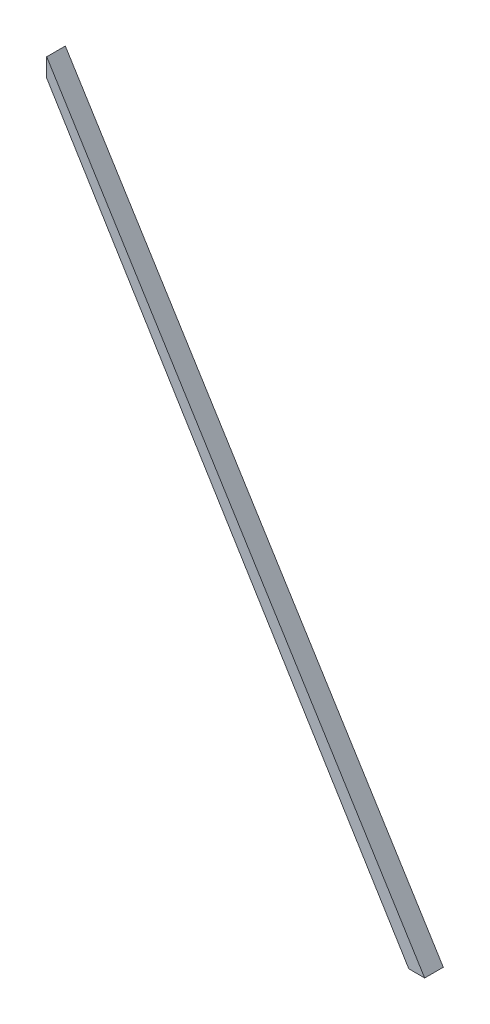
ISO-10303-21;
HEADER;
FILE_DESCRIPTION(('STEP AP214'),'2;1');
FILE_NAME('part.step','',(''),(''),'','','');
FILE_SCHEMA(('AUTOMOTIVE_DESIGN { 1 0 10303 214 1 1 1 1 }'));
ENDSEC;
DATA;
#1=APPLICATION_CONTEXT('core data for automotive mechanical design processes');
#2=APPLICATION_PROTOCOL_DEFINITION('international standard','automotive_design',2000,#1);
#3=PRODUCT_CONTEXT('',#1,'mechanical');
#4=PRODUCT('Part','Part','',(#3));
#5=PRODUCT_RELATED_PRODUCT_CATEGORY('part','',(#4));
#6=PRODUCT_DEFINITION_FORMATION('','',#4);
#7=PRODUCT_DEFINITION_CONTEXT('part definition',#1,'design');
#8=PRODUCT_DEFINITION('design','',#6,#7);
#9=PRODUCT_DEFINITION_SHAPE('','',#8);
#10=(LENGTH_UNIT() NAMED_UNIT(*) SI_UNIT(.MILLI.,.METRE.));
#11=(NAMED_UNIT(*) PLANE_ANGLE_UNIT() SI_UNIT($,.RADIAN.));
#12=(NAMED_UNIT(*) SI_UNIT($,.STERADIAN.) SOLID_ANGLE_UNIT());
#13=UNCERTAINTY_MEASURE_WITH_UNIT(LENGTH_MEASURE(1.E-05),#10,'distance_accuracy_value','');
#14=(GEOMETRIC_REPRESENTATION_CONTEXT(3) GLOBAL_UNCERTAINTY_ASSIGNED_CONTEXT((#13)) GLOBAL_UNIT_ASSIGNED_CONTEXT((#10,
#11,#12)) REPRESENTATION_CONTEXT('',''));
#15=CARTESIAN_POINT('',(0.,0.,0.));
#16=DIRECTION('',(0.,0.,1.));
#17=DIRECTION('',(1.,0.,0.));
#18=AXIS2_PLACEMENT_3D('',#15,#16,#17);
#19=CARTESIAN_POINT('',(0.,830.58,-25.4));
#20=DIRECTION('',(-1.,0.,0.));
#21=DIRECTION('',(0.,0.,1.));
#22=AXIS2_PLACEMENT_3D('',#19,#20,#21);
#23=PLANE('',#22);
#24=DIRECTION('',(0.,0.,-1.));
#25=VECTOR('',#24,1.);
#26=CARTESIAN_POINT('',(0.,805.281725573241,101.6));
#27=LINE('',#26,#25);
#28=CARTESIAN_POINT('',(0.,805.281725573241,0.));
#29=VERTEX_POINT('',#28);
#30=CARTESIAN_POINT('',(0.,805.281725573241,-25.4));
#31=VERTEX_POINT('',#30);
#32=EDGE_CURVE('E82',#29,#31,#27,.T.);
#33=ORIENTED_EDGE('',*,*,#32,.F.);
#34=DIRECTION('',(0.,-1.,0.));
#35=VECTOR('',#34,1.);
#36=CARTESIAN_POINT('',(0.,830.58,0.));
#37=LINE('',#36,#35);
#38=CARTESIAN_POINT('',(0.,830.58,0.));
#39=VERTEX_POINT('',#38);
#40=EDGE_CURVE('E98',#39,#29,#37,.T.);
#41=ORIENTED_EDGE('',*,*,#40,.F.);
#42=DIRECTION('',(0.,0.,1.));
#43=VECTOR('',#42,1.);
#44=CARTESIAN_POINT('',(0.,830.58,-25.4));
#45=LINE('',#44,#43);
#46=CARTESIAN_POINT('',(0.,830.58,-25.4));
#47=VERTEX_POINT('',#46);
#48=EDGE_CURVE('E44',#47,#39,#45,.T.);
#49=ORIENTED_EDGE('',*,*,#48,.F.);
#50=DIRECTION('',(0.,-1.,0.));
#51=VECTOR('',#50,1.);
#52=CARTESIAN_POINT('',(0.,830.58,-25.4));
#53=LINE('',#52,#51);
#54=EDGE_CURVE('E90',#47,#31,#53,.T.);
#55=ORIENTED_EDGE('',*,*,#54,.T.);
#56=EDGE_LOOP('',(#33,#41,#49,#55));
#57=FACE_BOUND('',#56,.T.);
#58=ADVANCED_FACE('F37',(#57),#23,.T.);
#59=CARTESIAN_POINT('',(0.,830.58,-25.4));
#60=DIRECTION('',(0.849600020411567,0.527427535607181,0.));
#61=DIRECTION('',(-0.527427535607181,0.849600020411568,0.));
#62=AXIS2_PLACEMENT_3D('',#59,#60,#61);
#63=PLANE('',#62);
#64=DIRECTION('',(-0.527427535607181,0.849600020411567,0.));
#65=VECTOR('',#64,1.);
#66=CARTESIAN_POINT('',(0.,830.58,0.));
#67=LINE('',#66,#65);
#68=CARTESIAN_POINT('',(515.62,0.,0.));
#69=VERTEX_POINT('',#68);
#70=EDGE_CURVE('E94',#69,#39,#67,.T.);
#71=ORIENTED_EDGE('',*,*,#70,.F.);
#72=DIRECTION('',(0.,0.,1.));
#73=VECTOR('',#72,1.);
#74=CARTESIAN_POINT('',(515.62,0.,-25.4));
#75=LINE('',#74,#73);
#76=CARTESIAN_POINT('',(515.62,0.,-25.4));
#77=VERTEX_POINT('',#76);
#78=EDGE_CURVE('E70',#77,#69,#75,.T.);
#79=ORIENTED_EDGE('',*,*,#78,.F.);
#80=DIRECTION('',(-0.527427535607181,0.849600020411567,0.));
#81=VECTOR('',#80,1.);
#82=CARTESIAN_POINT('',(0.,830.58,-25.4));
#83=LINE('',#82,#81);
#84=EDGE_CURVE('E93',#77,#47,#83,.T.);
#85=ORIENTED_EDGE('',*,*,#84,.T.);
#86=ORIENTED_EDGE('',*,*,#48,.T.);
#87=EDGE_LOOP('',(#71,#79,#85,#86));
#88=FACE_BOUND('',#87,.T.);
#89=ADVANCED_FACE('F106',(#88),#63,.T.);
#90=CARTESIAN_POINT('',(0.,0.,-25.4));
#91=DIRECTION('',(0.,0.,-1.));
#92=DIRECTION('',(-1.,0.,0.));
#93=AXIS2_PLACEMENT_3D('',#90,#91,#92);
#94=PLANE('',#93);
#95=DIRECTION('',(0.522884311230758,-0.852403658526132,0.));
#96=VECTOR('',#95,1.);
#97=CARTESIAN_POINT('',(0.,805.281725573241,-25.4));
#98=LINE('',#97,#96);
#99=CARTESIAN_POINT('',(493.978617068748,0.,-25.4));
#100=VERTEX_POINT('',#99);
#101=EDGE_CURVE('E51',#31,#100,#98,.T.);
#102=ORIENTED_EDGE('',*,*,#101,.F.);
#103=ORIENTED_EDGE('',*,*,#54,.F.);
#104=ORIENTED_EDGE('',*,*,#84,.F.);
#105=DIRECTION('',(1.,0.,0.));
#106=VECTOR('',#105,1.);
#107=CARTESIAN_POINT('',(0.,0.,-25.4));
#108=LINE('',#107,#106);
#109=EDGE_CURVE('E74',#100,#77,#108,.T.);
#110=ORIENTED_EDGE('',*,*,#109,.F.);
#111=EDGE_LOOP('',(#102,#103,#104,#110));
#112=FACE_BOUND('',#111,.T.);
#113=ADVANCED_FACE('F88',(#112),#94,.T.);
#114=CARTESIAN_POINT('',(0.,0.,0.));
#115=DIRECTION('',(0.,0.,-1.));
#116=DIRECTION('',(-1.,0.,0.));
#117=AXIS2_PLACEMENT_3D('',#114,#115,#116);
#118=PLANE('',#117);
#119=ORIENTED_EDGE('',*,*,#40,.T.);
#120=DIRECTION('',(0.522884311230758,-0.852403658526132,0.));
#121=VECTOR('',#120,1.);
#122=CARTESIAN_POINT('',(358.920909885234,220.170468386022,0.));
#123=LINE('',#122,#121);
#124=CARTESIAN_POINT('',(493.978617068748,0.,0.));
#125=VERTEX_POINT('',#124);
#126=EDGE_CURVE('E84',#29,#125,#123,.T.);
#127=ORIENTED_EDGE('',*,*,#126,.T.);
#128=DIRECTION('',(-1.,0.,0.));
#129=VECTOR('',#128,1.);
#130=CARTESIAN_POINT('',(515.62,0.,0.));
#131=LINE('',#130,#129);
#132=EDGE_CURVE('E109',#69,#125,#131,.T.);
#133=ORIENTED_EDGE('',*,*,#132,.F.);
#134=ORIENTED_EDGE('',*,*,#70,.T.);
#135=EDGE_LOOP('',(#119,#127,#133,#134));
#136=FACE_BOUND('',#135,.T.);
#137=ADVANCED_FACE('F108',(#136),#118,.F.);
#138=CARTESIAN_POINT('',(515.62,0.,-127.));
#139=DIRECTION('',(0.,1.,0.));
#140=DIRECTION('',(-1.,0.,0.));
#141=AXIS2_PLACEMENT_3D('',#138,#139,#140);
#142=PLANE('',#141);
#143=ORIENTED_EDGE('',*,*,#132,.T.);
#144=DIRECTION('',(0.,0.,-1.));
#145=VECTOR('',#144,1.);
#146=CARTESIAN_POINT('',(493.978617068748,0.,-127.));
#147=LINE('',#146,#145);
#148=EDGE_CURVE('E11',#125,#100,#147,.T.);
#149=ORIENTED_EDGE('',*,*,#148,.T.);
#150=ORIENTED_EDGE('',*,*,#109,.T.);
#151=ORIENTED_EDGE('',*,*,#78,.T.);
#152=EDGE_LOOP('',(#143,#149,#150,#151));
#153=FACE_BOUND('',#152,.T.);
#154=ADVANCED_FACE('F111',(#153),#142,.F.);
#155=CARTESIAN_POINT('',(0.,805.281725573241,101.6));
#156=DIRECTION('',(0.852403658526132,0.522884311230758,0.));
#157=DIRECTION('',(-0.522884311230758,0.852403658526132,0.));
#158=AXIS2_PLACEMENT_3D('',#155,#156,#157);
#159=PLANE('',#158);
#160=ORIENTED_EDGE('',*,*,#32,.T.);
#161=ORIENTED_EDGE('',*,*,#101,.T.);
#162=ORIENTED_EDGE('',*,*,#148,.F.);
#163=ORIENTED_EDGE('',*,*,#126,.F.);
#164=EDGE_LOOP('',(#160,#161,#162,#163));
#165=FACE_BOUND('',#164,.T.);
#166=ADVANCED_FACE('F83',(#165),#159,.F.);
#167=CLOSED_SHELL('',(#58,#89,#113,#137,#154,#166));
#168=MANIFOLD_SOLID_BREP('B2',#167);
#169=ADVANCED_BREP_SHAPE_REPRESENTATION('',(#18,#168),#14);
#170=SHAPE_DEFINITION_REPRESENTATION(#9,#169);
ENDSEC;
END-ISO-10303-21;
